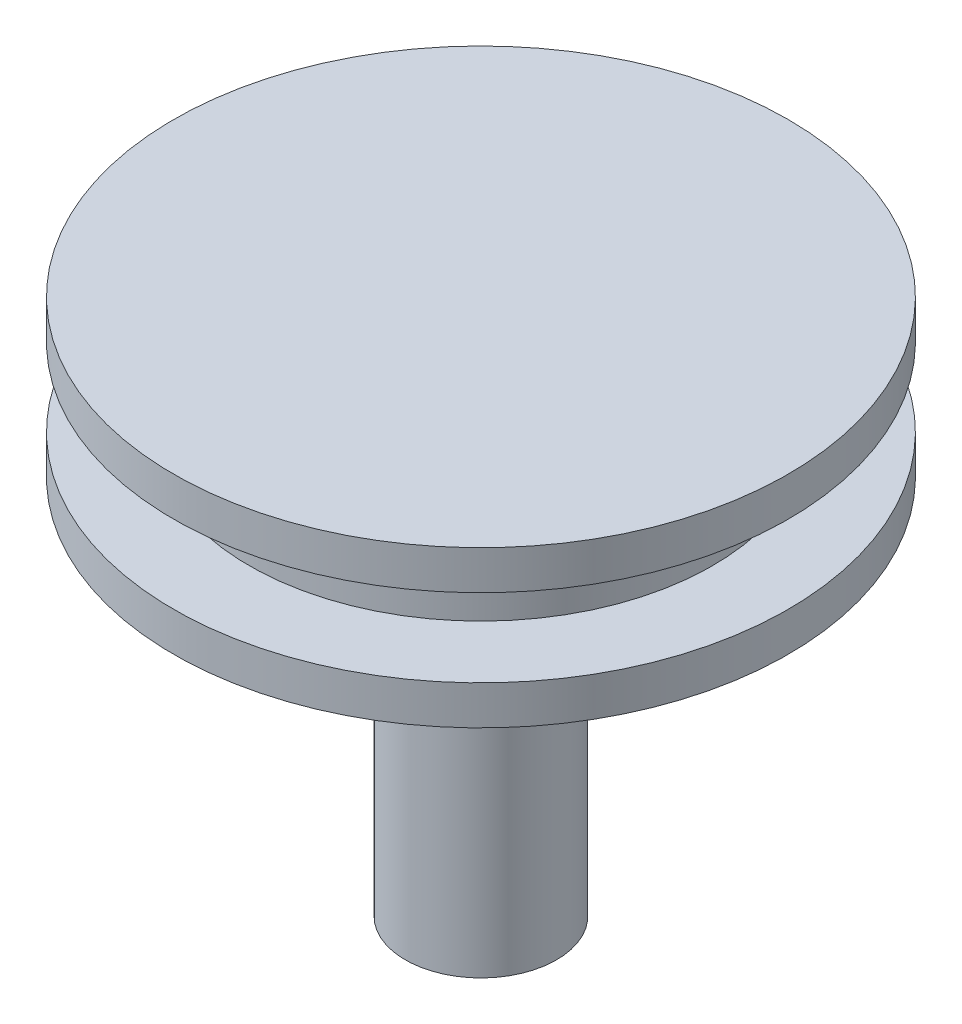
ISO-10303-21;
HEADER;
FILE_DESCRIPTION(('STEP AP214'),'2;1');
FILE_NAME('part.step','',(''),(''),'','','');
FILE_SCHEMA(('AUTOMOTIVE_DESIGN { 1 0 10303 214 1 1 1 1 }'));
ENDSEC;
DATA;
#1=APPLICATION_CONTEXT('core data for automotive mechanical design processes');
#2=APPLICATION_PROTOCOL_DEFINITION('international standard','automotive_design',2000,#1);
#3=PRODUCT_CONTEXT('',#1,'mechanical');
#4=PRODUCT('Part','Part','',(#3));
#5=PRODUCT_RELATED_PRODUCT_CATEGORY('part','',(#4));
#6=PRODUCT_DEFINITION_FORMATION('','',#4);
#7=PRODUCT_DEFINITION_CONTEXT('part definition',#1,'design');
#8=PRODUCT_DEFINITION('design','',#6,#7);
#9=PRODUCT_DEFINITION_SHAPE('','',#8);
#10=(LENGTH_UNIT() NAMED_UNIT(*) SI_UNIT(.MILLI.,.METRE.));
#11=(NAMED_UNIT(*) PLANE_ANGLE_UNIT() SI_UNIT($,.RADIAN.));
#12=(NAMED_UNIT(*) SI_UNIT($,.STERADIAN.) SOLID_ANGLE_UNIT());
#13=UNCERTAINTY_MEASURE_WITH_UNIT(LENGTH_MEASURE(1.E-05),#10,'distance_accuracy_value','');
#14=(GEOMETRIC_REPRESENTATION_CONTEXT(3) GLOBAL_UNCERTAINTY_ASSIGNED_CONTEXT((#13)) GLOBAL_UNIT_ASSIGNED_CONTEXT((#10,
#11,#12)) REPRESENTATION_CONTEXT('',''));
#15=CARTESIAN_POINT('',(0.,0.,0.));
#16=DIRECTION('',(0.,0.,1.));
#17=DIRECTION('',(1.,0.,0.));
#18=AXIS2_PLACEMENT_3D('',#15,#16,#17);
#19=CARTESIAN_POINT('',(0.,0.,-1.55));
#20=DIRECTION('',(0.,-1.,0.));
#21=DIRECTION('',(0.,0.,-1.));
#22=AXIS2_PLACEMENT_3D('',#19,#20,#21);
#23=PLANE('',#22);
#24=CARTESIAN_POINT('',(0.,0.,0.));
#25=DIRECTION('',(0.,-1.,0.));
#26=DIRECTION('',(0.,0.,-1.));
#27=AXIS2_PLACEMENT_3D('',#24,#25,#26);
#28=CIRCLE('',#27,1.55);
#29=CARTESIAN_POINT('',(0.,0.,-1.55));
#30=VERTEX_POINT('',#29);
#31=EDGE_CURVE('E59',#30,#30,#28,.T.);
#32=ORIENTED_EDGE('',*,*,#31,.T.);
#33=EDGE_LOOP('',(#32));
#34=FACE_BOUND('',#33,.T.);
#35=ADVANCED_FACE('F31',(#34),#23,.T.);
#36=CARTESIAN_POINT('',(0.,11.,0.));
#37=DIRECTION('',(0.,1.,0.));
#38=DIRECTION('',(0.,0.,1.));
#39=AXIS2_PLACEMENT_3D('',#36,#37,#38);
#40=PLANE('',#39);
#41=CARTESIAN_POINT('',(0.,11.,0.));
#42=DIRECTION('',(0.,-1.,0.));
#43=DIRECTION('',(0.,0.,-1.));
#44=AXIS2_PLACEMENT_3D('',#41,#42,#43);
#45=CIRCLE('',#44,6.3);
#46=CARTESIAN_POINT('',(0.,11.,-6.3));
#47=VERTEX_POINT('',#46);
#48=EDGE_CURVE('E10',#47,#47,#45,.T.);
#49=ORIENTED_EDGE('',*,*,#48,.F.);
#50=EDGE_LOOP('',(#49));
#51=FACE_BOUND('',#50,.T.);
#52=ADVANCED_FACE('F76',(#51),#40,.T.);
#53=CARTESIAN_POINT('',(0.,0.,0.));
#54=DIRECTION('',(0.,-1.,0.));
#55=DIRECTION('',(0.,0.,-1.));
#56=AXIS2_PLACEMENT_3D('',#53,#54,#55);
#57=CYLINDRICAL_SURFACE('',#56,6.3);
#58=ORIENTED_EDGE('',*,*,#48,.T.);
#59=EDGE_LOOP('',(#58));
#60=FACE_BOUND('',#59,.T.);
#61=CARTESIAN_POINT('',(0.,10.2,0.));
#62=DIRECTION('',(0.,-1.,0.));
#63=DIRECTION('',(0.,0.,-1.));
#64=AXIS2_PLACEMENT_3D('',#61,#62,#63);
#65=CIRCLE('',#64,6.3);
#66=CARTESIAN_POINT('',(0.,10.2,-6.3));
#67=VERTEX_POINT('',#66);
#68=EDGE_CURVE('E37',#67,#67,#65,.T.);
#69=ORIENTED_EDGE('',*,*,#68,.F.);
#70=EDGE_LOOP('',(#69));
#71=FACE_BOUND('',#70,.T.);
#72=ADVANCED_FACE('F80',(#60,#71),#57,.T.);
#73=CARTESIAN_POINT('',(0.,10.2,-6.3));
#74=DIRECTION('',(0.,-1.,0.));
#75=DIRECTION('',(0.,0.,-1.));
#76=AXIS2_PLACEMENT_3D('',#73,#74,#75);
#77=PLANE('',#76);
#78=ORIENTED_EDGE('',*,*,#68,.T.);
#79=EDGE_LOOP('',(#78));
#80=FACE_BOUND('',#79,.T.);
#81=CARTESIAN_POINT('',(0.,10.2,0.));
#82=DIRECTION('',(0.,-1.,0.));
#83=DIRECTION('',(0.,0.,-1.));
#84=AXIS2_PLACEMENT_3D('',#81,#82,#83);
#85=CIRCLE('',#84,4.75);
#86=CARTESIAN_POINT('',(0.,10.2,-4.75));
#87=VERTEX_POINT('',#86);
#88=EDGE_CURVE('E41',#87,#87,#85,.T.);
#89=ORIENTED_EDGE('',*,*,#88,.F.);
#90=EDGE_LOOP('',(#89));
#91=FACE_BOUND('',#90,.T.);
#92=ADVANCED_FACE('F85',(#80,#91),#77,.T.);
#93=CARTESIAN_POINT('',(0.,0.,0.));
#94=DIRECTION('',(0.,-1.,0.));
#95=DIRECTION('',(0.,0.,-1.));
#96=AXIS2_PLACEMENT_3D('',#93,#94,#95);
#97=CYLINDRICAL_SURFACE('',#96,4.75);
#98=ORIENTED_EDGE('',*,*,#88,.T.);
#99=EDGE_LOOP('',(#98));
#100=FACE_BOUND('',#99,.T.);
#101=CARTESIAN_POINT('',(0.,8.6,0.));
#102=DIRECTION('',(0.,-1.,0.));
#103=DIRECTION('',(0.,0.,-1.));
#104=AXIS2_PLACEMENT_3D('',#101,#102,#103);
#105=CIRCLE('',#104,4.75);
#106=CARTESIAN_POINT('',(0.,8.6,-4.75));
#107=VERTEX_POINT('',#106);
#108=EDGE_CURVE('E45',#107,#107,#105,.T.);
#109=ORIENTED_EDGE('',*,*,#108,.F.);
#110=EDGE_LOOP('',(#109));
#111=FACE_BOUND('',#110,.T.);
#112=ADVANCED_FACE('F90',(#100,#111),#97,.T.);
#113=CARTESIAN_POINT('',(0.,8.6,-4.75));
#114=DIRECTION('',(0.,1.,0.));
#115=DIRECTION('',(0.,0.,1.));
#116=AXIS2_PLACEMENT_3D('',#113,#114,#115);
#117=PLANE('',#116);
#118=ORIENTED_EDGE('',*,*,#108,.T.);
#119=EDGE_LOOP('',(#118));
#120=FACE_BOUND('',#119,.T.);
#121=CARTESIAN_POINT('',(0.,8.6,0.));
#122=DIRECTION('',(0.,-1.,0.));
#123=DIRECTION('',(0.,0.,-1.));
#124=AXIS2_PLACEMENT_3D('',#121,#122,#123);
#125=CIRCLE('',#124,6.3);
#126=CARTESIAN_POINT('',(0.,8.6,-6.3));
#127=VERTEX_POINT('',#126);
#128=EDGE_CURVE('E50',#127,#127,#125,.T.);
#129=ORIENTED_EDGE('',*,*,#128,.F.);
#130=EDGE_LOOP('',(#129));
#131=FACE_BOUND('',#130,.T.);
#132=ADVANCED_FACE('F93',(#120,#131),#117,.T.);
#133=CARTESIAN_POINT('',(0.,0.,0.));
#134=DIRECTION('',(0.,-1.,0.));
#135=DIRECTION('',(0.,0.,-1.));
#136=AXIS2_PLACEMENT_3D('',#133,#134,#135);
#137=CYLINDRICAL_SURFACE('',#136,6.3);
#138=ORIENTED_EDGE('',*,*,#128,.T.);
#139=EDGE_LOOP('',(#138));
#140=FACE_BOUND('',#139,.T.);
#141=CARTESIAN_POINT('',(0.,7.8,0.));
#142=DIRECTION('',(0.,-1.,0.));
#143=DIRECTION('',(0.,0.,-1.));
#144=AXIS2_PLACEMENT_3D('',#141,#142,#143);
#145=CIRCLE('',#144,6.3);
#146=CARTESIAN_POINT('',(0.,7.8,-6.3));
#147=VERTEX_POINT('',#146);
#148=EDGE_CURVE('E53',#147,#147,#145,.T.);
#149=ORIENTED_EDGE('',*,*,#148,.F.);
#150=EDGE_LOOP('',(#149));
#151=FACE_BOUND('',#150,.T.);
#152=ADVANCED_FACE('F72',(#140,#151),#137,.T.);
#153=CARTESIAN_POINT('',(0.,7.8,-6.3));
#154=DIRECTION('',(0.,-1.,0.));
#155=DIRECTION('',(0.,0.,-1.));
#156=AXIS2_PLACEMENT_3D('',#153,#154,#155);
#157=PLANE('',#156);
#158=ORIENTED_EDGE('',*,*,#148,.T.);
#159=EDGE_LOOP('',(#158));
#160=FACE_BOUND('',#159,.T.);
#161=CARTESIAN_POINT('',(0.,7.8,0.));
#162=DIRECTION('',(0.,-1.,0.));
#163=DIRECTION('',(0.,0.,-1.));
#164=AXIS2_PLACEMENT_3D('',#161,#162,#163);
#165=CIRCLE('',#164,1.55);
#166=CARTESIAN_POINT('',(0.,7.8,-1.55));
#167=VERTEX_POINT('',#166);
#168=EDGE_CURVE('E56',#167,#167,#165,.T.);
#169=ORIENTED_EDGE('',*,*,#168,.F.);
#170=EDGE_LOOP('',(#169));
#171=FACE_BOUND('',#170,.T.);
#172=ADVANCED_FACE('F66',(#160,#171),#157,.T.);
#173=CARTESIAN_POINT('',(0.,0.,0.));
#174=DIRECTION('',(0.,-1.,0.));
#175=DIRECTION('',(0.,0.,-1.));
#176=AXIS2_PLACEMENT_3D('',#173,#174,#175);
#177=CYLINDRICAL_SURFACE('',#176,1.55);
#178=ORIENTED_EDGE('',*,*,#168,.T.);
#179=EDGE_LOOP('',(#178));
#180=FACE_BOUND('',#179,.T.);
#181=ORIENTED_EDGE('',*,*,#31,.F.);
#182=EDGE_LOOP('',(#181));
#183=FACE_BOUND('',#182,.T.);
#184=ADVANCED_FACE('F64',(#180,#183),#177,.T.);
#185=CLOSED_SHELL('',(#35,#52,#72,#92,#112,#132,#152,#172,#184));
#186=MANIFOLD_SOLID_BREP('B2',#185);
#187=ADVANCED_BREP_SHAPE_REPRESENTATION('',(#18,#186),#14);
#188=SHAPE_DEFINITION_REPRESENTATION(#9,#187);
ENDSEC;
END-ISO-10303-21;
